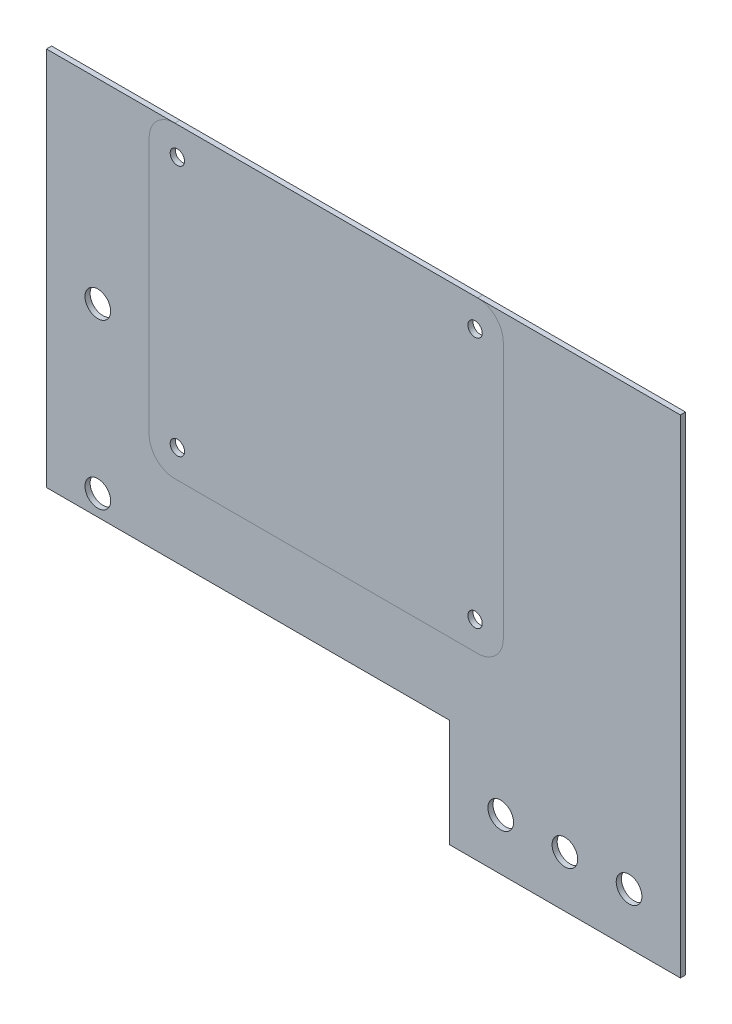
ISO-10303-21;
HEADER;
FILE_DESCRIPTION(('STEP AP214'),'2;1');
FILE_NAME('part.step','',(''),(''),'','','');
FILE_SCHEMA(('AUTOMOTIVE_DESIGN { 1 0 10303 214 1 1 1 1 }'));
ENDSEC;
DATA;
#1=APPLICATION_CONTEXT('core data for automotive mechanical design processes');
#2=APPLICATION_PROTOCOL_DEFINITION('international standard','automotive_design',2000,#1);
#3=PRODUCT_CONTEXT('',#1,'mechanical');
#4=PRODUCT('Part','Part','',(#3));
#5=PRODUCT_RELATED_PRODUCT_CATEGORY('part','',(#4));
#6=PRODUCT_DEFINITION_FORMATION('','',#4);
#7=PRODUCT_DEFINITION_CONTEXT('part definition',#1,'design');
#8=PRODUCT_DEFINITION('design','',#6,#7);
#9=PRODUCT_DEFINITION_SHAPE('','',#8);
#10=(LENGTH_UNIT() NAMED_UNIT(*) SI_UNIT(.MILLI.,.METRE.));
#11=(NAMED_UNIT(*) PLANE_ANGLE_UNIT() SI_UNIT($,.RADIAN.));
#12=(NAMED_UNIT(*) SI_UNIT($,.STERADIAN.) SOLID_ANGLE_UNIT());
#13=UNCERTAINTY_MEASURE_WITH_UNIT(LENGTH_MEASURE(1.E-05),#10,'distance_accuracy_value','');
#14=(GEOMETRIC_REPRESENTATION_CONTEXT(3) GLOBAL_UNCERTAINTY_ASSIGNED_CONTEXT((#13)) GLOBAL_UNIT_ASSIGNED_CONTEXT((#10,
#11,#12)) REPRESENTATION_CONTEXT('',''));
#15=CARTESIAN_POINT('',(0.,0.,0.));
#16=DIRECTION('',(0.,0.,1.));
#17=DIRECTION('',(1.,0.,0.));
#18=AXIS2_PLACEMENT_3D('',#15,#16,#17);
#19=CARTESIAN_POINT('',(80.2271756833517,0.,53.9908655605488));
#20=DIRECTION('',(-1.,0.,0.));
#21=DIRECTION('',(0.,-1.,0.));
#22=AXIS2_PLACEMENT_3D('',#19,#20,#21);
#23=PLANE('',#22);
#24=DIRECTION('',(0.,-1.,0.));
#25=VECTOR('',#24,1.);
#26=CARTESIAN_POINT('',(80.2271756833517,0.,54.9908655605488));
#27=LINE('',#26,#25);
#28=CARTESIAN_POINT('',(80.2271756833517,64.3578080314677,54.9908655605488));
#29=VERTEX_POINT('',#28);
#30=CARTESIAN_POINT('',(80.2271756833517,-30.6421919685324,54.9908655605488));
#31=VERTEX_POINT('',#30);
#32=EDGE_CURVE('E194',#29,#31,#27,.T.);
#33=ORIENTED_EDGE('',*,*,#32,.T.);
#34=DIRECTION('',(0.,0.,1.));
#35=VECTOR('',#34,1.);
#36=CARTESIAN_POINT('',(80.2271756833517,-30.6421919685324,53.9908655605488));
#37=LINE('',#36,#35);
#38=CARTESIAN_POINT('',(80.2271756833517,-30.6421919685324,53.9908655605488));
#39=VERTEX_POINT('',#38);
#40=EDGE_CURVE('E12',#39,#31,#37,.T.);
#41=ORIENTED_EDGE('',*,*,#40,.F.);
#42=DIRECTION('',(0.,-1.,0.));
#43=VECTOR('',#42,1.);
#44=CARTESIAN_POINT('',(80.2271756833517,0.,53.9908655605488));
#45=LINE('',#44,#43);
#46=CARTESIAN_POINT('',(80.2271756833517,64.3578080314677,53.9908655605488));
#47=VERTEX_POINT('',#46);
#48=EDGE_CURVE('E64',#47,#39,#45,.T.);
#49=ORIENTED_EDGE('',*,*,#48,.F.);
#50=DIRECTION('',(0.,0.,1.));
#51=VECTOR('',#50,1.);
#52=CARTESIAN_POINT('',(80.2271756833517,64.3578080314677,53.9908655605488));
#53=LINE('',#52,#51);
#54=EDGE_CURVE('E49',#47,#29,#53,.T.);
#55=ORIENTED_EDGE('',*,*,#54,.T.);
#56=EDGE_LOOP('',(#33,#41,#49,#55));
#57=FACE_BOUND('',#56,.T.);
#58=ADVANCED_FACE('F46',(#57),#23,.F.);
#59=CARTESIAN_POINT('',(0.,-30.6421919685324,53.9908655605488));
#60=DIRECTION('',(0.,-1.,0.));
#61=DIRECTION('',(1.,0.,0.));
#62=AXIS2_PLACEMENT_3D('',#59,#60,#61);
#63=PLANE('',#62);
#64=DIRECTION('',(1.,0.,0.));
#65=VECTOR('',#64,1.);
#66=CARTESIAN_POINT('',(0.,-30.6421919685324,54.9908655605488));
#67=LINE('',#66,#65);
#68=CARTESIAN_POINT('',(35.2271756833517,-30.6421919685324,54.9908655605488));
#69=VERTEX_POINT('',#68);
#70=EDGE_CURVE('E219',#69,#31,#67,.T.);
#71=ORIENTED_EDGE('',*,*,#70,.F.);
#72=DIRECTION('',(0.,0.,1.));
#73=VECTOR('',#72,1.);
#74=CARTESIAN_POINT('',(35.2271756833517,-30.6421919685324,53.9908655605488));
#75=LINE('',#74,#73);
#76=CARTESIAN_POINT('',(35.2271756833517,-30.6421919685324,53.9908655605488));
#77=VERTEX_POINT('',#76);
#78=EDGE_CURVE('E55',#77,#69,#75,.T.);
#79=ORIENTED_EDGE('',*,*,#78,.F.);
#80=DIRECTION('',(1.,0.,0.));
#81=VECTOR('',#80,1.);
#82=CARTESIAN_POINT('',(0.,-30.6421919685324,53.9908655605488));
#83=LINE('',#82,#81);
#84=EDGE_CURVE('E161',#77,#39,#83,.T.);
#85=ORIENTED_EDGE('',*,*,#84,.T.);
#86=ORIENTED_EDGE('',*,*,#40,.T.);
#87=EDGE_LOOP('',(#71,#79,#85,#86));
#88=FACE_BOUND('',#87,.T.);
#89=ADVANCED_FACE('F273',(#88),#63,.T.);
#90=CARTESIAN_POINT('',(35.2271756833517,0.,53.9908655605488));
#91=DIRECTION('',(1.,0.,0.));
#92=DIRECTION('',(0.,0.,-1.));
#93=AXIS2_PLACEMENT_3D('',#90,#91,#92);
#94=PLANE('',#93);
#95=DIRECTION('',(0.,1.,0.));
#96=VECTOR('',#95,1.);
#97=CARTESIAN_POINT('',(35.2271756833517,0.,54.9908655605488));
#98=LINE('',#97,#96);
#99=CARTESIAN_POINT('',(35.2271756833517,-9.64219196853236,54.9908655605488));
#100=VERTEX_POINT('',#99);
#101=EDGE_CURVE('E165',#69,#100,#98,.T.);
#102=ORIENTED_EDGE('',*,*,#101,.T.);
#103=DIRECTION('',(0.,0.,1.));
#104=VECTOR('',#103,1.);
#105=CARTESIAN_POINT('',(35.2271756833517,-9.64219196853236,53.9908655605488));
#106=LINE('',#105,#104);
#107=CARTESIAN_POINT('',(35.2271756833517,-9.64219196853236,53.9908655605488));
#108=VERTEX_POINT('',#107);
#109=EDGE_CURVE('E163',#108,#100,#106,.T.);
#110=ORIENTED_EDGE('',*,*,#109,.F.);
#111=DIRECTION('',(0.,1.,0.));
#112=VECTOR('',#111,1.);
#113=CARTESIAN_POINT('',(35.2271756833517,0.,53.9908655605488));
#114=LINE('',#113,#112);
#115=EDGE_CURVE('E153',#77,#108,#114,.T.);
#116=ORIENTED_EDGE('',*,*,#115,.F.);
#117=ORIENTED_EDGE('',*,*,#78,.T.);
#118=EDGE_LOOP('',(#102,#110,#116,#117));
#119=FACE_BOUND('',#118,.T.);
#120=ADVANCED_FACE('F164',(#119),#94,.F.);
#121=CARTESIAN_POINT('',(0.,-9.64219196853236,53.9908655605488));
#122=DIRECTION('',(0.,-1.,0.));
#123=DIRECTION('',(0.,0.,-1.));
#124=AXIS2_PLACEMENT_3D('',#121,#122,#123);
#125=PLANE('',#124);
#126=DIRECTION('',(1.,0.,0.));
#127=VECTOR('',#126,1.);
#128=CARTESIAN_POINT('',(0.,-9.64219196853236,54.9908655605488));
#129=LINE('',#128,#127);
#130=CARTESIAN_POINT('',(-43.2728243166483,-9.64219196853236,54.9908655605488));
#131=VERTEX_POINT('',#130);
#132=EDGE_CURVE('E216',#131,#100,#129,.T.);
#133=ORIENTED_EDGE('',*,*,#132,.F.);
#134=DIRECTION('',(0.,0.,1.));
#135=VECTOR('',#134,1.);
#136=CARTESIAN_POINT('',(-43.2728243166483,-9.64219196853236,53.9908655605488));
#137=LINE('',#136,#135);
#138=CARTESIAN_POINT('',(-43.2728243166483,-9.64219196853236,53.9908655605488));
#139=VERTEX_POINT('',#138);
#140=EDGE_CURVE('E169',#139,#131,#137,.T.);
#141=ORIENTED_EDGE('',*,*,#140,.F.);
#142=DIRECTION('',(1.,0.,0.));
#143=VECTOR('',#142,1.);
#144=CARTESIAN_POINT('',(0.,-9.64219196853236,53.9908655605488));
#145=LINE('',#144,#143);
#146=EDGE_CURVE('E159',#139,#108,#145,.T.);
#147=ORIENTED_EDGE('',*,*,#146,.T.);
#148=ORIENTED_EDGE('',*,*,#109,.T.);
#149=EDGE_LOOP('',(#133,#141,#147,#148));
#150=FACE_BOUND('',#149,.T.);
#151=ADVANCED_FACE('F171',(#150),#125,.T.);
#152=CARTESIAN_POINT('',(-43.2728243166483,0.,53.9908655605488));
#153=DIRECTION('',(-1.,0.,0.));
#154=DIRECTION('',(0.,-1.,0.));
#155=AXIS2_PLACEMENT_3D('',#152,#153,#154);
#156=PLANE('',#155);
#157=DIRECTION('',(0.,-1.,0.));
#158=VECTOR('',#157,1.);
#159=CARTESIAN_POINT('',(-43.2728243166483,0.,54.9908655605488));
#160=LINE('',#159,#158);
#161=CARTESIAN_POINT('',(-43.2728243166483,64.3578080314677,54.9908655605488));
#162=VERTEX_POINT('',#161);
#163=EDGE_CURVE('E213',#162,#131,#160,.T.);
#164=ORIENTED_EDGE('',*,*,#163,.F.);
#165=DIRECTION('',(0.,0.,1.));
#166=VECTOR('',#165,1.);
#167=CARTESIAN_POINT('',(-43.2728243166483,64.3578080314677,53.9908655605488));
#168=LINE('',#167,#166);
#169=CARTESIAN_POINT('',(-43.2728243166483,64.3578080314677,53.9908655605488));
#170=VERTEX_POINT('',#169);
#171=EDGE_CURVE('E239',#170,#162,#168,.T.);
#172=ORIENTED_EDGE('',*,*,#171,.F.);
#173=DIRECTION('',(0.,-1.,0.));
#174=VECTOR('',#173,1.);
#175=CARTESIAN_POINT('',(-43.2728243166483,0.,53.9908655605488));
#176=LINE('',#175,#174);
#177=EDGE_CURVE('E172',#170,#139,#176,.T.);
#178=ORIENTED_EDGE('',*,*,#177,.T.);
#179=ORIENTED_EDGE('',*,*,#140,.T.);
#180=EDGE_LOOP('',(#164,#172,#178,#179));
#181=FACE_BOUND('',#180,.T.);
#182=ADVANCED_FACE('F287',(#181),#156,.T.);
#183=CARTESIAN_POINT('',(0.,64.3578080314677,53.9908655605488));
#184=DIRECTION('',(0.,-1.,0.));
#185=DIRECTION('',(0.,0.,-1.));
#186=AXIS2_PLACEMENT_3D('',#183,#184,#185);
#187=PLANE('',#186);
#188=DIRECTION('',(1.,0.,0.));
#189=VECTOR('',#188,1.);
#190=CARTESIAN_POINT('',(0.,64.3578080314677,54.9908655605488));
#191=LINE('',#190,#189);
#192=CARTESIAN_POINT('',(-18.2728243166483,64.3578080314677,54.9908655605488));
#193=VERTEX_POINT('',#192);
#194=EDGE_CURVE('E199',#162,#193,#191,.T.);
#195=ORIENTED_EDGE('',*,*,#194,.T.);
#196=DIRECTION('',(0.,0.,1.));
#197=VECTOR('',#196,1.);
#198=CARTESIAN_POINT('',(-18.2728243166483,64.3578080314677,53.9908655605488));
#199=LINE('',#198,#197);
#200=CARTESIAN_POINT('',(-18.2728243166483,64.3578080314677,53.9908655605488));
#201=VERTEX_POINT('',#200);
#202=EDGE_CURVE('E241',#201,#193,#199,.T.);
#203=ORIENTED_EDGE('',*,*,#202,.F.);
#204=DIRECTION('',(1.,0.,0.));
#205=VECTOR('',#204,1.);
#206=CARTESIAN_POINT('',(0.,64.3578080314677,53.9908655605488));
#207=LINE('',#206,#205);
#208=EDGE_CURVE('E174',#170,#201,#207,.T.);
#209=ORIENTED_EDGE('',*,*,#208,.F.);
#210=ORIENTED_EDGE('',*,*,#171,.T.);
#211=EDGE_LOOP('',(#195,#203,#209,#210));
#212=FACE_BOUND('',#211,.T.);
#213=ADVANCED_FACE('F290',(#212),#187,.F.);
#214=CARTESIAN_POINT('',(-18.2728243166483,59.3578080314678,53.9908655605488));
#215=DIRECTION('',(0.,0.,1.));
#216=DIRECTION('',(1.,0.,0.));
#217=AXIS2_PLACEMENT_3D('',#214,#215,#216);
#218=CYLINDRICAL_SURFACE('',#217,4.99999999999999);
#219=CARTESIAN_POINT('',(-18.2728243166483,59.3578080314678,54.9908655605488));
#220=DIRECTION('',(0.,0.,1.));
#221=DIRECTION('',(1.,0.,0.));
#222=AXIS2_PLACEMENT_3D('',#219,#220,#221);
#223=CIRCLE('',#222,4.99999999999999);
#224=CARTESIAN_POINT('',(-23.2728243166483,59.3578080314677,54.9908655605488));
#225=VERTEX_POINT('',#224);
#226=EDGE_CURVE('E211',#193,#225,#223,.T.);
#227=ORIENTED_EDGE('',*,*,#226,.T.);
#228=DIRECTION('',(0.,0.,1.));
#229=VECTOR('',#228,1.);
#230=CARTESIAN_POINT('',(-23.2728243166483,59.3578080314677,53.9908655605488));
#231=LINE('',#230,#229);
#232=CARTESIAN_POINT('',(-23.2728243166483,59.3578080314677,53.9908655605488));
#233=VERTEX_POINT('',#232);
#234=EDGE_CURVE('E244',#233,#225,#231,.T.);
#235=ORIENTED_EDGE('',*,*,#234,.F.);
#236=CARTESIAN_POINT('',(-18.2728243166483,59.3578080314678,53.9908655605488));
#237=DIRECTION('',(0.,0.,1.));
#238=DIRECTION('',(1.,0.,0.));
#239=AXIS2_PLACEMENT_3D('',#236,#237,#238);
#240=CIRCLE('',#239,4.99999999999999);
#241=EDGE_CURVE('E353',#201,#233,#240,.T.);
#242=ORIENTED_EDGE('',*,*,#241,.F.);
#243=ORIENTED_EDGE('',*,*,#202,.T.);
#244=EDGE_LOOP('',(#227,#235,#242,#243));
#245=FACE_BOUND('',#244,.T.);
#246=ADVANCED_FACE('F294',(#245),#218,.F.);
#247=CARTESIAN_POINT('',(-23.2728243166483,0.,53.9908655605488));
#248=DIRECTION('',(-1.,0.,0.));
#249=DIRECTION('',(0.,-1.,0.));
#250=AXIS2_PLACEMENT_3D('',#247,#248,#249);
#251=PLANE('',#250);
#252=DIRECTION('',(0.,-1.,0.));
#253=VECTOR('',#252,1.);
#254=CARTESIAN_POINT('',(-23.2728243166483,0.,54.9908655605488));
#255=LINE('',#254,#253);
#256=CARTESIAN_POINT('',(-23.2728243166483,9.35780803146777,54.9908655605488));
#257=VERTEX_POINT('',#256);
#258=EDGE_CURVE('E209',#225,#257,#255,.T.);
#259=ORIENTED_EDGE('',*,*,#258,.T.);
#260=DIRECTION('',(0.,0.,1.));
#261=VECTOR('',#260,1.);
#262=CARTESIAN_POINT('',(-23.2728243166483,9.35780803146777,53.9908655605488));
#263=LINE('',#262,#261);
#264=CARTESIAN_POINT('',(-23.2728243166483,9.35780803146777,53.9908655605488));
#265=VERTEX_POINT('',#264);
#266=EDGE_CURVE('E247',#265,#257,#263,.T.);
#267=ORIENTED_EDGE('',*,*,#266,.F.);
#268=DIRECTION('',(0.,-1.,0.));
#269=VECTOR('',#268,1.);
#270=CARTESIAN_POINT('',(-23.2728243166483,0.,53.9908655605488));
#271=LINE('',#270,#269);
#272=EDGE_CURVE('E350',#233,#265,#271,.T.);
#273=ORIENTED_EDGE('',*,*,#272,.F.);
#274=ORIENTED_EDGE('',*,*,#234,.T.);
#275=EDGE_LOOP('',(#259,#267,#273,#274));
#276=FACE_BOUND('',#275,.T.);
#277=ADVANCED_FACE('F299',(#276),#251,.F.);
#278=CARTESIAN_POINT('',(-18.2728243166483,9.35780803146775,53.9908655605488));
#279=DIRECTION('',(0.,0.,1.));
#280=DIRECTION('',(1.,0.,0.));
#281=AXIS2_PLACEMENT_3D('',#278,#279,#280);
#282=CYLINDRICAL_SURFACE('',#281,5.);
#283=CARTESIAN_POINT('',(-18.2728243166483,9.35780803146775,54.9908655605488));
#284=DIRECTION('',(0.,0.,1.));
#285=DIRECTION('',(1.,0.,0.));
#286=AXIS2_PLACEMENT_3D('',#283,#284,#285);
#287=CIRCLE('',#286,5.);
#288=CARTESIAN_POINT('',(-18.2728243166483,4.35780803146775,54.9908655605488));
#289=VERTEX_POINT('',#288);
#290=EDGE_CURVE('E207',#257,#289,#287,.T.);
#291=ORIENTED_EDGE('',*,*,#290,.T.);
#292=DIRECTION('',(0.,0.,1.));
#293=VECTOR('',#292,1.);
#294=CARTESIAN_POINT('',(-18.2728243166483,4.35780803146775,53.9908655605488));
#295=LINE('',#294,#293);
#296=CARTESIAN_POINT('',(-18.2728243166483,4.35780803146775,53.9908655605488));
#297=VERTEX_POINT('',#296);
#298=EDGE_CURVE('E250',#297,#289,#295,.T.);
#299=ORIENTED_EDGE('',*,*,#298,.F.);
#300=CARTESIAN_POINT('',(-18.2728243166483,9.35780803146775,53.9908655605488));
#301=DIRECTION('',(0.,0.,1.));
#302=DIRECTION('',(1.,0.,0.));
#303=AXIS2_PLACEMENT_3D('',#300,#301,#302);
#304=CIRCLE('',#303,5.);
#305=EDGE_CURVE('E348',#265,#297,#304,.T.);
#306=ORIENTED_EDGE('',*,*,#305,.F.);
#307=ORIENTED_EDGE('',*,*,#266,.T.);
#308=EDGE_LOOP('',(#291,#299,#306,#307));
#309=FACE_BOUND('',#308,.T.);
#310=ADVANCED_FACE('F303',(#309),#282,.F.);
#311=CARTESIAN_POINT('',(0.,4.35780803146775,53.9908655605488));
#312=DIRECTION('',(0.,-1.,0.));
#313=DIRECTION('',(0.,0.,-1.));
#314=AXIS2_PLACEMENT_3D('',#311,#312,#313);
#315=PLANE('',#314);
#316=DIRECTION('',(1.,0.,0.));
#317=VECTOR('',#316,1.);
#318=CARTESIAN_POINT('',(0.,4.35780803146775,54.9908655605488));
#319=LINE('',#318,#317);
#320=CARTESIAN_POINT('',(40.7271756833517,4.35780803146771,54.9908655605488));
#321=VERTEX_POINT('',#320);
#322=EDGE_CURVE('E205',#289,#321,#319,.T.);
#323=ORIENTED_EDGE('',*,*,#322,.T.);
#324=DIRECTION('',(0.,0.,1.));
#325=VECTOR('',#324,1.);
#326=CARTESIAN_POINT('',(40.7271756833517,4.35780803146771,53.9908655605488));
#327=LINE('',#326,#325);
#328=CARTESIAN_POINT('',(40.7271756833517,4.35780803146771,53.9908655605488));
#329=VERTEX_POINT('',#328);
#330=EDGE_CURVE('E253',#329,#321,#327,.T.);
#331=ORIENTED_EDGE('',*,*,#330,.F.);
#332=DIRECTION('',(1.,0.,0.));
#333=VECTOR('',#332,1.);
#334=CARTESIAN_POINT('',(0.,4.35780803146775,53.9908655605488));
#335=LINE('',#334,#333);
#336=EDGE_CURVE('E341',#297,#329,#335,.T.);
#337=ORIENTED_EDGE('',*,*,#336,.F.);
#338=ORIENTED_EDGE('',*,*,#298,.T.);
#339=EDGE_LOOP('',(#323,#331,#337,#338));
#340=FACE_BOUND('',#339,.T.);
#341=ADVANCED_FACE('F307',(#340),#315,.F.);
#342=CARTESIAN_POINT('',(40.7271756833517,9.35780803146761,53.9908655605488));
#343=DIRECTION('',(0.,0.,1.));
#344=DIRECTION('',(1.,0.,0.));
#345=AXIS2_PLACEMENT_3D('',#342,#343,#344);
#346=CYLINDRICAL_SURFACE('',#345,4.9999999999999);
#347=CARTESIAN_POINT('',(40.7271756833517,9.35780803146761,54.9908655605488));
#348=DIRECTION('',(0.,0.,1.));
#349=DIRECTION('',(1.,0.,0.));
#350=AXIS2_PLACEMENT_3D('',#347,#348,#349);
#351=CIRCLE('',#350,4.9999999999999);
#352=CARTESIAN_POINT('',(45.7271756833517,9.35780803146761,54.9908655605488));
#353=VERTEX_POINT('',#352);
#354=EDGE_CURVE('E203',#321,#353,#351,.T.);
#355=ORIENTED_EDGE('',*,*,#354,.T.);
#356=DIRECTION('',(0.,0.,1.));
#357=VECTOR('',#356,1.);
#358=CARTESIAN_POINT('',(45.7271756833517,9.35780803146761,53.9908655605488));
#359=LINE('',#358,#357);
#360=CARTESIAN_POINT('',(45.7271756833517,9.35780803146761,53.9908655605488));
#361=VERTEX_POINT('',#360);
#362=EDGE_CURVE('E256',#361,#353,#359,.T.);
#363=ORIENTED_EDGE('',*,*,#362,.F.);
#364=CARTESIAN_POINT('',(40.7271756833517,9.35780803146761,53.9908655605488));
#365=DIRECTION('',(0.,0.,1.));
#366=DIRECTION('',(1.,0.,0.));
#367=AXIS2_PLACEMENT_3D('',#364,#365,#366);
#368=CIRCLE('',#367,4.9999999999999);
#369=EDGE_CURVE('E338',#329,#361,#368,.T.);
#370=ORIENTED_EDGE('',*,*,#369,.F.);
#371=ORIENTED_EDGE('',*,*,#330,.T.);
#372=EDGE_LOOP('',(#355,#363,#370,#371));
#373=FACE_BOUND('',#372,.T.);
#374=ADVANCED_FACE('F311',(#373),#346,.F.);
#375=CARTESIAN_POINT('',(45.7271756833516,0.,53.9908655605488));
#376=DIRECTION('',(1.,0.,0.));
#377=DIRECTION('',(0.,1.,0.));
#378=AXIS2_PLACEMENT_3D('',#375,#376,#377);
#379=PLANE('',#378);
#380=DIRECTION('',(0.,1.,0.));
#381=VECTOR('',#380,1.);
#382=CARTESIAN_POINT('',(45.7271756833516,0.,54.9908655605488));
#383=LINE('',#382,#381);
#384=CARTESIAN_POINT('',(45.7271756833518,59.3578080314676,54.9908655605488));
#385=VERTEX_POINT('',#384);
#386=EDGE_CURVE('E201',#353,#385,#383,.T.);
#387=ORIENTED_EDGE('',*,*,#386,.T.);
#388=DIRECTION('',(0.,0.,1.));
#389=VECTOR('',#388,1.);
#390=CARTESIAN_POINT('',(45.7271756833518,59.3578080314676,53.9908655605488));
#391=LINE('',#390,#389);
#392=CARTESIAN_POINT('',(45.7271756833518,59.3578080314676,53.9908655605488));
#393=VERTEX_POINT('',#392);
#394=EDGE_CURVE('E259',#393,#385,#391,.T.);
#395=ORIENTED_EDGE('',*,*,#394,.F.);
#396=DIRECTION('',(0.,1.,0.));
#397=VECTOR('',#396,1.);
#398=CARTESIAN_POINT('',(45.7271756833516,0.,53.9908655605488));
#399=LINE('',#398,#397);
#400=EDGE_CURVE('E336',#361,#393,#399,.T.);
#401=ORIENTED_EDGE('',*,*,#400,.F.);
#402=ORIENTED_EDGE('',*,*,#362,.T.);
#403=EDGE_LOOP('',(#387,#395,#401,#402));
#404=FACE_BOUND('',#403,.T.);
#405=ADVANCED_FACE('F315',(#404),#379,.F.);
#406=CARTESIAN_POINT('',(40.7271756833517,59.3578080314676,53.9908655605488));
#407=DIRECTION('',(0.,0.,1.));
#408=DIRECTION('',(1.,0.,0.));
#409=AXIS2_PLACEMENT_3D('',#406,#407,#408);
#410=CYLINDRICAL_SURFACE('',#409,5.00000000000004);
#411=CARTESIAN_POINT('',(40.7271756833517,59.3578080314676,54.9908655605488));
#412=DIRECTION('',(0.,0.,1.));
#413=DIRECTION('',(1.,0.,0.));
#414=AXIS2_PLACEMENT_3D('',#411,#412,#413);
#415=CIRCLE('',#414,5.00000000000004);
#416=CARTESIAN_POINT('',(40.7271756833517,64.3578080314677,54.9908655605488));
#417=VERTEX_POINT('',#416);
#418=EDGE_CURVE('E198',#385,#417,#415,.T.);
#419=ORIENTED_EDGE('',*,*,#418,.T.);
#420=DIRECTION('',(0.,0.,1.));
#421=VECTOR('',#420,1.);
#422=CARTESIAN_POINT('',(40.7271756833517,64.3578080314677,53.9908655605488));
#423=LINE('',#422,#421);
#424=CARTESIAN_POINT('',(40.7271756833517,64.3578080314677,53.9908655605488));
#425=VERTEX_POINT('',#424);
#426=EDGE_CURVE('E261',#425,#417,#423,.T.);
#427=ORIENTED_EDGE('',*,*,#426,.F.);
#428=CARTESIAN_POINT('',(40.7271756833517,59.3578080314676,53.9908655605488));
#429=DIRECTION('',(0.,0.,1.));
#430=DIRECTION('',(1.,0.,0.));
#431=AXIS2_PLACEMENT_3D('',#428,#429,#430);
#432=CIRCLE('',#431,5.00000000000004);
#433=EDGE_CURVE('E361',#393,#425,#432,.T.);
#434=ORIENTED_EDGE('',*,*,#433,.F.);
#435=ORIENTED_EDGE('',*,*,#394,.T.);
#436=EDGE_LOOP('',(#419,#427,#434,#435));
#437=FACE_BOUND('',#436,.T.);
#438=ADVANCED_FACE('F318',(#437),#410,.F.);
#439=CARTESIAN_POINT('',(57.7271756833517,-20.6421919685324,53.9908655605488));
#440=DIRECTION('',(0.,0.,1.));
#441=DIRECTION('',(1.,0.,0.));
#442=AXIS2_PLACEMENT_3D('',#439,#440,#441);
#443=CYLINDRICAL_SURFACE('',#442,2.5);
#444=CARTESIAN_POINT('',(57.7271756833517,-20.6421919685324,53.9908655605488));
#445=DIRECTION('',(0.,0.,1.));
#446=DIRECTION('',(1.,0.,0.));
#447=AXIS2_PLACEMENT_3D('',#444,#445,#446);
#448=CIRCLE('',#447,2.5);
#449=CARTESIAN_POINT('',(60.2271756833517,-20.6421919685324,53.9908655605488));
#450=VERTEX_POINT('',#449);
#451=EDGE_CURVE('E188',#450,#450,#448,.T.);
#452=ORIENTED_EDGE('',*,*,#451,.F.);
#453=EDGE_LOOP('',(#452));
#454=FACE_BOUND('',#453,.T.);
#455=CARTESIAN_POINT('',(57.7271756833517,-20.6421919685324,54.9908655605488));
#456=DIRECTION('',(0.,0.,1.));
#457=DIRECTION('',(1.,0.,0.));
#458=AXIS2_PLACEMENT_3D('',#455,#456,#457);
#459=CIRCLE('',#458,2.5);
#460=CARTESIAN_POINT('',(60.2271756833517,-20.6421919685324,54.9908655605488));
#461=VERTEX_POINT('',#460);
#462=EDGE_CURVE('E231',#461,#461,#459,.T.);
#463=ORIENTED_EDGE('',*,*,#462,.T.);
#464=EDGE_LOOP('',(#463));
#465=FACE_BOUND('',#464,.T.);
#466=ADVANCED_FACE('F321',(#454,#465),#443,.F.);
#467=CARTESIAN_POINT('',(70.2271756833517,-20.6421919685324,53.9908655605488));
#468=DIRECTION('',(0.,0.,1.));
#469=DIRECTION('',(1.,0.,0.));
#470=AXIS2_PLACEMENT_3D('',#467,#468,#469);
#471=CYLINDRICAL_SURFACE('',#470,2.5);
#472=CARTESIAN_POINT('',(70.2271756833517,-20.6421919685324,53.9908655605488));
#473=DIRECTION('',(0.,0.,1.));
#474=DIRECTION('',(1.,0.,0.));
#475=AXIS2_PLACEMENT_3D('',#472,#473,#474);
#476=CIRCLE('',#475,2.5);
#477=CARTESIAN_POINT('',(72.7271756833517,-20.6421919685324,53.9908655605488));
#478=VERTEX_POINT('',#477);
#479=EDGE_CURVE('E185',#478,#478,#476,.T.);
#480=ORIENTED_EDGE('',*,*,#479,.F.);
#481=EDGE_LOOP('',(#480));
#482=FACE_BOUND('',#481,.T.);
#483=CARTESIAN_POINT('',(70.2271756833517,-20.6421919685324,54.9908655605488));
#484=DIRECTION('',(0.,0.,1.));
#485=DIRECTION('',(1.,0.,0.));
#486=AXIS2_PLACEMENT_3D('',#483,#484,#485);
#487=CIRCLE('',#486,2.5);
#488=CARTESIAN_POINT('',(72.7271756833517,-20.6421919685324,54.9908655605488));
#489=VERTEX_POINT('',#488);
#490=EDGE_CURVE('E228',#489,#489,#487,.T.);
#491=ORIENTED_EDGE('',*,*,#490,.T.);
#492=EDGE_LOOP('',(#491));
#493=FACE_BOUND('',#492,.T.);
#494=ADVANCED_FACE('F326',(#482,#493),#471,.F.);
#495=CARTESIAN_POINT('',(-33.2728243166483,-5.64219196853236,53.9908655605488));
#496=DIRECTION('',(0.,0.,1.));
#497=DIRECTION('',(1.,0.,0.));
#498=AXIS2_PLACEMENT_3D('',#495,#496,#497);
#499=CYLINDRICAL_SURFACE('',#498,2.5);
#500=CARTESIAN_POINT('',(-33.2728243166483,-5.64219196853236,53.9908655605488));
#501=DIRECTION('',(0.,0.,1.));
#502=DIRECTION('',(1.,0.,0.));
#503=AXIS2_PLACEMENT_3D('',#500,#501,#502);
#504=CIRCLE('',#503,2.5);
#505=CARTESIAN_POINT('',(-30.7728243166483,-5.64219196853236,53.9908655605488));
#506=VERTEX_POINT('',#505);
#507=EDGE_CURVE('E182',#506,#506,#504,.T.);
#508=ORIENTED_EDGE('',*,*,#507,.F.);
#509=EDGE_LOOP('',(#508));
#510=FACE_BOUND('',#509,.T.);
#511=CARTESIAN_POINT('',(-33.2728243166483,-5.64219196853236,54.9908655605488));
#512=DIRECTION('',(0.,0.,1.));
#513=DIRECTION('',(1.,0.,0.));
#514=AXIS2_PLACEMENT_3D('',#511,#512,#513);
#515=CIRCLE('',#514,2.5);
#516=CARTESIAN_POINT('',(-30.7728243166483,-5.64219196853236,54.9908655605488));
#517=VERTEX_POINT('',#516);
#518=EDGE_CURVE('E225',#517,#517,#515,.T.);
#519=ORIENTED_EDGE('',*,*,#518,.T.);
#520=EDGE_LOOP('',(#519));
#521=FACE_BOUND('',#520,.T.);
#522=ADVANCED_FACE('F375',(#510,#521),#499,.F.);
#523=CARTESIAN_POINT('',(-33.2728243166483,26.3578080314676,53.9908655605488));
#524=DIRECTION('',(0.,0.,1.));
#525=DIRECTION('',(1.,0.,0.));
#526=AXIS2_PLACEMENT_3D('',#523,#524,#525);
#527=CYLINDRICAL_SURFACE('',#526,2.5);
#528=CARTESIAN_POINT('',(-33.2728243166483,26.3578080314676,53.9908655605488));
#529=DIRECTION('',(0.,0.,1.));
#530=DIRECTION('',(1.,0.,0.));
#531=AXIS2_PLACEMENT_3D('',#528,#529,#530);
#532=CIRCLE('',#531,2.5);
#533=CARTESIAN_POINT('',(-30.7728243166483,26.3578080314676,53.9908655605488));
#534=VERTEX_POINT('',#533);
#535=EDGE_CURVE('E179',#534,#534,#532,.T.);
#536=ORIENTED_EDGE('',*,*,#535,.F.);
#537=EDGE_LOOP('',(#536));
#538=FACE_BOUND('',#537,.T.);
#539=CARTESIAN_POINT('',(-33.2728243166483,26.3578080314676,54.9908655605488));
#540=DIRECTION('',(0.,0.,1.));
#541=DIRECTION('',(1.,0.,0.));
#542=AXIS2_PLACEMENT_3D('',#539,#540,#541);
#543=CIRCLE('',#542,2.5);
#544=CARTESIAN_POINT('',(-30.7728243166483,26.3578080314676,54.9908655605488));
#545=VERTEX_POINT('',#544);
#546=EDGE_CURVE('E222',#545,#545,#543,.T.);
#547=ORIENTED_EDGE('',*,*,#546,.T.);
#548=EDGE_LOOP('',(#547));
#549=FACE_BOUND('',#548,.T.);
#550=ADVANCED_FACE('F282',(#538,#549),#527,.F.);
#551=EDGE_CURVE('E196',#417,#29,#191,.T.);
#552=ORIENTED_EDGE('',*,*,#551,.T.);
#553=ORIENTED_EDGE('',*,*,#54,.F.);
#554=EDGE_CURVE('E121',#425,#47,#207,.T.);
#555=ORIENTED_EDGE('',*,*,#554,.F.);
#556=ORIENTED_EDGE('',*,*,#426,.T.);
#557=EDGE_LOOP('',(#552,#553,#555,#556));
#558=FACE_BOUND('',#557,.T.);
#559=ADVANCED_FACE('F296',(#558),#187,.F.);
#560=CARTESIAN_POINT('',(45.2271756833517,-20.6421919685324,53.9908655605488));
#561=DIRECTION('',(0.,0.,1.));
#562=DIRECTION('',(1.,0.,0.));
#563=AXIS2_PLACEMENT_3D('',#560,#561,#562);
#564=CYLINDRICAL_SURFACE('',#563,2.5);
#565=CARTESIAN_POINT('',(45.2271756833517,-20.6421919685324,53.9908655605488));
#566=DIRECTION('',(0.,0.,1.));
#567=DIRECTION('',(1.,0.,0.));
#568=AXIS2_PLACEMENT_3D('',#565,#566,#567);
#569=CIRCLE('',#568,2.5);
#570=CARTESIAN_POINT('',(47.7271756833517,-20.6421919685324,53.9908655605488));
#571=VERTEX_POINT('',#570);
#572=EDGE_CURVE('E191',#571,#571,#569,.T.);
#573=ORIENTED_EDGE('',*,*,#572,.F.);
#574=EDGE_LOOP('',(#573));
#575=FACE_BOUND('',#574,.T.);
#576=CARTESIAN_POINT('',(45.2271756833517,-20.6421919685324,54.9908655605488));
#577=DIRECTION('',(0.,0.,1.));
#578=DIRECTION('',(1.,0.,0.));
#579=AXIS2_PLACEMENT_3D('',#576,#577,#578);
#580=CIRCLE('',#579,2.5);
#581=CARTESIAN_POINT('',(47.7271756833517,-20.6421919685324,54.9908655605488));
#582=VERTEX_POINT('',#581);
#583=EDGE_CURVE('E234',#582,#582,#580,.T.);
#584=ORIENTED_EDGE('',*,*,#583,.T.);
#585=EDGE_LOOP('',(#584));
#586=FACE_BOUND('',#585,.T.);
#587=ADVANCED_FACE('F368',(#575,#586),#564,.F.);
#588=CARTESIAN_POINT('',(0.,0.,53.9908655605488));
#589=DIRECTION('',(0.,0.,1.));
#590=DIRECTION('',(1.,0.,0.));
#591=AXIS2_PLACEMENT_3D('',#588,#589,#590);
#592=PLANE('',#591);
#593=ORIENTED_EDGE('',*,*,#48,.T.);
#594=ORIENTED_EDGE('',*,*,#84,.F.);
#595=ORIENTED_EDGE('',*,*,#115,.T.);
#596=ORIENTED_EDGE('',*,*,#146,.F.);
#597=ORIENTED_EDGE('',*,*,#177,.F.);
#598=ORIENTED_EDGE('',*,*,#208,.T.);
#599=ORIENTED_EDGE('',*,*,#241,.T.);
#600=ORIENTED_EDGE('',*,*,#272,.T.);
#601=ORIENTED_EDGE('',*,*,#305,.T.);
#602=ORIENTED_EDGE('',*,*,#336,.T.);
#603=ORIENTED_EDGE('',*,*,#369,.T.);
#604=ORIENTED_EDGE('',*,*,#400,.T.);
#605=ORIENTED_EDGE('',*,*,#433,.T.);
#606=ORIENTED_EDGE('',*,*,#554,.T.);
#607=EDGE_LOOP('',(#593,#594,#595,#596,#597,#598,#599,#600,#601,#602,#603,#604,#605,#606));
#608=FACE_BOUND('',#607,.T.);
#609=ORIENTED_EDGE('',*,*,#535,.T.);
#610=EDGE_LOOP('',(#609));
#611=FACE_BOUND('',#610,.T.);
#612=ORIENTED_EDGE('',*,*,#507,.T.);
#613=EDGE_LOOP('',(#612));
#614=FACE_BOUND('',#613,.T.);
#615=ORIENTED_EDGE('',*,*,#479,.T.);
#616=EDGE_LOOP('',(#615));
#617=FACE_BOUND('',#616,.T.);
#618=ORIENTED_EDGE('',*,*,#451,.T.);
#619=EDGE_LOOP('',(#618));
#620=FACE_BOUND('',#619,.T.);
#621=ORIENTED_EDGE('',*,*,#572,.T.);
#622=EDGE_LOOP('',(#621));
#623=FACE_BOUND('',#622,.T.);
#624=ADVANCED_FACE('F155',(#608,#611,#614,#617,#620,#623),#592,.F.);
#625=CARTESIAN_POINT('',(0.,0.,54.9908655605488));
#626=DIRECTION('',(0.,0.,1.));
#627=DIRECTION('',(1.,0.,0.));
#628=AXIS2_PLACEMENT_3D('',#625,#626,#627);
#629=PLANE('',#628);
#630=ORIENTED_EDGE('',*,*,#32,.F.);
#631=ORIENTED_EDGE('',*,*,#551,.F.);
#632=ORIENTED_EDGE('',*,*,#418,.F.);
#633=ORIENTED_EDGE('',*,*,#386,.F.);
#634=ORIENTED_EDGE('',*,*,#354,.F.);
#635=ORIENTED_EDGE('',*,*,#322,.F.);
#636=ORIENTED_EDGE('',*,*,#290,.F.);
#637=ORIENTED_EDGE('',*,*,#258,.F.);
#638=ORIENTED_EDGE('',*,*,#226,.F.);
#639=ORIENTED_EDGE('',*,*,#194,.F.);
#640=ORIENTED_EDGE('',*,*,#163,.T.);
#641=ORIENTED_EDGE('',*,*,#132,.T.);
#642=ORIENTED_EDGE('',*,*,#101,.F.);
#643=ORIENTED_EDGE('',*,*,#70,.T.);
#644=EDGE_LOOP('',(#630,#631,#632,#633,#634,#635,#636,#637,#638,#639,#640,#641,#642,#643));
#645=FACE_BOUND('',#644,.T.);
#646=ORIENTED_EDGE('',*,*,#546,.F.);
#647=EDGE_LOOP('',(#646));
#648=FACE_BOUND('',#647,.T.);
#649=ORIENTED_EDGE('',*,*,#518,.F.);
#650=EDGE_LOOP('',(#649));
#651=FACE_BOUND('',#650,.T.);
#652=ORIENTED_EDGE('',*,*,#490,.F.);
#653=EDGE_LOOP('',(#652));
#654=FACE_BOUND('',#653,.T.);
#655=ORIENTED_EDGE('',*,*,#462,.F.);
#656=EDGE_LOOP('',(#655));
#657=FACE_BOUND('',#656,.T.);
#658=ORIENTED_EDGE('',*,*,#583,.F.);
#659=EDGE_LOOP('',(#658));
#660=FACE_BOUND('',#659,.T.);
#661=ADVANCED_FACE('F270',(#645,#648,#651,#654,#657,#660),#629,.T.);
#662=CLOSED_SHELL('',(#58,#89,#120,#151,#182,#213,#246,#277,#310,#341,#374,#405,#438,#466,#494,
#522,#550,#559,#587,#624,#661));
#663=MANIFOLD_SOLID_BREP('B2',#662);
#664=CARTESIAN_POINT('',(-18.2728243166483,59.3578080314678,54.2908655605488));
#665=DIRECTION('',(0.,0.,1.));
#666=DIRECTION('',(1.,0.,0.));
#667=AXIS2_PLACEMENT_3D('',#664,#665,#666);
#668=CYLINDRICAL_SURFACE('',#667,4.99999999999999);
#669=DIRECTION('',(0.,0.,1.));
#670=VECTOR('',#669,1.);
#671=CARTESIAN_POINT('',(-23.2728243166483,59.3578080314677,54.2908655605488));
#672=LINE('',#671,#670);
#673=CARTESIAN_POINT('',(-23.2728243166483,59.3578080314677,53.9908655605488));
#674=VERTEX_POINT('',#673);
#675=CARTESIAN_POINT('',(-23.2728243166483,59.3578080314677,54.9908655605488));
#676=VERTEX_POINT('',#675);
#677=EDGE_CURVE('E638',#674,#676,#672,.T.);
#678=ORIENTED_EDGE('',*,*,#677,.T.);
#679=CARTESIAN_POINT('',(-18.2728243166483,59.3578080314678,54.9908655605488));
#680=DIRECTION('',(0.,0.,1.));
#681=DIRECTION('',(1.,0.,0.));
#682=AXIS2_PLACEMENT_3D('',#679,#680,#681);
#683=CIRCLE('',#682,4.99999999999999);
#684=CARTESIAN_POINT('',(-18.2728243166483,64.3578080314677,54.9908655605488));
#685=VERTEX_POINT('',#684);
#686=EDGE_CURVE('E571',#676,#685,#683,.F.);
#687=ORIENTED_EDGE('',*,*,#686,.T.);
#688=DIRECTION('',(0.,0.,1.));
#689=VECTOR('',#688,1.);
#690=CARTESIAN_POINT('',(-18.2728243166483,64.3578080314677,54.2908655605488));
#691=LINE('',#690,#689);
#692=CARTESIAN_POINT('',(-18.2728243166483,64.3578080314677,53.9908655605488));
#693=VERTEX_POINT('',#692);
#694=EDGE_CURVE('E44',#693,#685,#691,.T.);
#695=ORIENTED_EDGE('',*,*,#694,.F.);
#696=CARTESIAN_POINT('',(-18.2728243166483,59.3578080314678,53.9908655605488));
#697=DIRECTION('',(0.,0.,1.));
#698=DIRECTION('',(1.,0.,0.));
#699=AXIS2_PLACEMENT_3D('',#696,#697,#698);
#700=CIRCLE('',#699,4.99999999999999);
#701=EDGE_CURVE('E677',#693,#674,#700,.T.);
#702=ORIENTED_EDGE('',*,*,#701,.T.);
#703=EDGE_LOOP('',(#678,#687,#695,#702));
#704=FACE_BOUND('',#703,.T.);
#705=ADVANCED_FACE('F555',(#704),#668,.T.);
#706=CARTESIAN_POINT('',(40.7271756833517,64.3578080314677,54.2908655605488));
#707=DIRECTION('',(0.,1.,0.));
#708=DIRECTION('',(-1.,0.,0.));
#709=AXIS2_PLACEMENT_3D('',#706,#707,#708);
#710=PLANE('',#709);
#711=ORIENTED_EDGE('',*,*,#694,.T.);
#712=DIRECTION('',(1.,0.,0.));
#713=VECTOR('',#712,1.);
#714=CARTESIAN_POINT('',(40.7271756833517,64.3578080314677,54.9908655605488));
#715=LINE('',#714,#713);
#716=CARTESIAN_POINT('',(40.7271756833517,64.3578080314677,54.9908655605488));
#717=VERTEX_POINT('',#716);
#718=EDGE_CURVE('E709',#685,#717,#715,.T.);
#719=ORIENTED_EDGE('',*,*,#718,.T.);
#720=DIRECTION('',(0.,0.,1.));
#721=VECTOR('',#720,1.);
#722=CARTESIAN_POINT('',(40.7271756833517,64.3578080314677,54.2908655605488));
#723=LINE('',#722,#721);
#724=CARTESIAN_POINT('',(40.7271756833517,64.3578080314676,53.9908655605488));
#725=VERTEX_POINT('',#724);
#726=EDGE_CURVE('E563',#725,#717,#723,.T.);
#727=ORIENTED_EDGE('',*,*,#726,.F.);
#728=DIRECTION('',(-1.,0.,0.));
#729=VECTOR('',#728,1.);
#730=CARTESIAN_POINT('',(40.7271756833517,64.3578080314676,53.9908655605488));
#731=LINE('',#730,#729);
#732=EDGE_CURVE('E674',#725,#693,#731,.T.);
#733=ORIENTED_EDGE('',*,*,#732,.T.);
#734=EDGE_LOOP('',(#711,#719,#727,#733));
#735=FACE_BOUND('',#734,.T.);
#736=ADVANCED_FACE('F717',(#735),#710,.T.);
#737=CARTESIAN_POINT('',(40.7271756833517,59.3578080314676,54.2908655605488));
#738=DIRECTION('',(0.,0.,1.));
#739=DIRECTION('',(1.,0.,0.));
#740=AXIS2_PLACEMENT_3D('',#737,#738,#739);
#741=CYLINDRICAL_SURFACE('',#740,5.00000000000004);
#742=ORIENTED_EDGE('',*,*,#726,.T.);
#743=CARTESIAN_POINT('',(40.7271756833517,59.3578080314676,54.9908655605488));
#744=DIRECTION('',(0.,0.,1.));
#745=DIRECTION('',(1.,0.,0.));
#746=AXIS2_PLACEMENT_3D('',#743,#744,#745);
#747=CIRCLE('',#746,5.00000000000004);
#748=CARTESIAN_POINT('',(45.7271756833517,59.3578080314676,54.9908655605488));
#749=VERTEX_POINT('',#748);
#750=EDGE_CURVE('E707',#717,#749,#747,.F.);
#751=ORIENTED_EDGE('',*,*,#750,.T.);
#752=DIRECTION('',(0.,0.,1.));
#753=VECTOR('',#752,1.);
#754=CARTESIAN_POINT('',(45.7271756833517,59.3578080314676,54.2908655605488));
#755=LINE('',#754,#753);
#756=CARTESIAN_POINT('',(45.7271756833517,59.3578080314676,53.9908655605488));
#757=VERTEX_POINT('',#756);
#758=EDGE_CURVE('E683',#757,#749,#755,.T.);
#759=ORIENTED_EDGE('',*,*,#758,.F.);
#760=CARTESIAN_POINT('',(40.7271756833517,59.3578080314676,53.9908655605488));
#761=DIRECTION('',(0.,0.,1.));
#762=DIRECTION('',(1.,0.,0.));
#763=AXIS2_PLACEMENT_3D('',#760,#761,#762);
#764=CIRCLE('',#763,5.00000000000002);
#765=EDGE_CURVE('E671',#757,#725,#764,.T.);
#766=ORIENTED_EDGE('',*,*,#765,.T.);
#767=EDGE_LOOP('',(#742,#751,#759,#766));
#768=FACE_BOUND('',#767,.T.);
#769=ADVANCED_FACE('F719',(#768),#741,.T.);
#770=CARTESIAN_POINT('',(45.7271756833517,9.35780803146765,54.2908655605488));
#771=DIRECTION('',(1.,0.,0.));
#772=DIRECTION('',(0.,1.,0.));
#773=AXIS2_PLACEMENT_3D('',#770,#771,#772);
#774=PLANE('',#773);
#775=ORIENTED_EDGE('',*,*,#758,.T.);
#776=DIRECTION('',(0.,-1.,0.));
#777=VECTOR('',#776,1.);
#778=CARTESIAN_POINT('',(45.7271756833517,9.35780803146765,54.9908655605488));
#779=LINE('',#778,#777);
#780=CARTESIAN_POINT('',(45.7271756833516,9.35780803146761,54.9908655605488));
#781=VERTEX_POINT('',#780);
#782=EDGE_CURVE('E705',#749,#781,#779,.T.);
#783=ORIENTED_EDGE('',*,*,#782,.T.);
#784=DIRECTION('',(0.,0.,1.));
#785=VECTOR('',#784,1.);
#786=CARTESIAN_POINT('',(45.7271756833516,9.35780803146761,54.2908655605488));
#787=LINE('',#786,#785);
#788=CARTESIAN_POINT('',(45.7271756833516,9.35780803146761,53.9908655605488));
#789=VERTEX_POINT('',#788);
#790=EDGE_CURVE('E686',#789,#781,#787,.T.);
#791=ORIENTED_EDGE('',*,*,#790,.F.);
#792=DIRECTION('',(0.,1.,0.));
#793=VECTOR('',#792,1.);
#794=CARTESIAN_POINT('',(45.7271756833516,9.35780803146761,53.9908655605488));
#795=LINE('',#794,#793);
#796=EDGE_CURVE('E668',#789,#757,#795,.T.);
#797=ORIENTED_EDGE('',*,*,#796,.T.);
#798=EDGE_LOOP('',(#775,#783,#791,#797));
#799=FACE_BOUND('',#798,.T.);
#800=ADVANCED_FACE('F703',(#799),#774,.T.);
#801=CARTESIAN_POINT('',(40.7271756833517,9.35780803146761,54.2908655605488));
#802=DIRECTION('',(0.,0.,1.));
#803=DIRECTION('',(1.,0.,0.));
#804=AXIS2_PLACEMENT_3D('',#801,#802,#803);
#805=CYLINDRICAL_SURFACE('',#804,4.9999999999999);
#806=ORIENTED_EDGE('',*,*,#790,.T.);
#807=CARTESIAN_POINT('',(40.7271756833517,9.35780803146761,54.9908655605488));
#808=DIRECTION('',(0.,0.,1.));
#809=DIRECTION('',(1.,0.,0.));
#810=AXIS2_PLACEMENT_3D('',#807,#808,#809);
#811=CIRCLE('',#810,4.9999999999999);
#812=CARTESIAN_POINT('',(40.7271756833517,4.35780803146775,54.9908655605488));
#813=VERTEX_POINT('',#812);
#814=EDGE_CURVE('E696',#781,#813,#811,.F.);
#815=ORIENTED_EDGE('',*,*,#814,.T.);
#816=DIRECTION('',(0.,0.,1.));
#817=VECTOR('',#816,1.);
#818=CARTESIAN_POINT('',(40.7271756833517,4.35780803146775,54.2908655605488));
#819=LINE('',#818,#817);
#820=CARTESIAN_POINT('',(40.7271756833517,4.35780803146774,53.9908655605488));
#821=VERTEX_POINT('',#820);
#822=EDGE_CURVE('E640',#821,#813,#819,.T.);
#823=ORIENTED_EDGE('',*,*,#822,.F.);
#824=CARTESIAN_POINT('',(40.7271756833517,9.35780803146761,53.9908655605488));
#825=DIRECTION('',(0.,0.,1.));
#826=DIRECTION('',(1.,0.,0.));
#827=AXIS2_PLACEMENT_3D('',#824,#825,#826);
#828=CIRCLE('',#827,4.99999999999987);
#829=EDGE_CURVE('E661',#821,#789,#828,.T.);
#830=ORIENTED_EDGE('',*,*,#829,.T.);
#831=EDGE_LOOP('',(#806,#815,#823,#830));
#832=FACE_BOUND('',#831,.T.);
#833=ADVANCED_FACE('F695',(#832),#805,.T.);
#834=CARTESIAN_POINT('',(-18.2728243166483,4.35780803146775,54.2908655605488));
#835=DIRECTION('',(0.,-1.,0.));
#836=DIRECTION('',(0.,0.,-1.));
#837=AXIS2_PLACEMENT_3D('',#834,#835,#836);
#838=PLANE('',#837);
#839=ORIENTED_EDGE('',*,*,#822,.T.);
#840=DIRECTION('',(-1.,0.,0.));
#841=VECTOR('',#840,1.);
#842=CARTESIAN_POINT('',(-18.2728243166483,4.35780803146775,54.9908655605488));
#843=LINE('',#842,#841);
#844=CARTESIAN_POINT('',(-18.2728243166483,4.35780803146775,54.9908655605488));
#845=VERTEX_POINT('',#844);
#846=EDGE_CURVE('E632',#813,#845,#843,.T.);
#847=ORIENTED_EDGE('',*,*,#846,.T.);
#848=DIRECTION('',(0.,0.,1.));
#849=VECTOR('',#848,1.);
#850=CARTESIAN_POINT('',(-18.2728243166483,4.35780803146775,54.2908655605488));
#851=LINE('',#850,#849);
#852=CARTESIAN_POINT('',(-18.2728243166483,4.35780803146775,53.9908655605488));
#853=VERTEX_POINT('',#852);
#854=EDGE_CURVE('E631',#853,#845,#851,.T.);
#855=ORIENTED_EDGE('',*,*,#854,.F.);
#856=DIRECTION('',(1.,0.,0.));
#857=VECTOR('',#856,1.);
#858=CARTESIAN_POINT('',(-18.2728243166483,4.35780803146775,53.9908655605488));
#859=LINE('',#858,#857);
#860=EDGE_CURVE('E658',#853,#821,#859,.T.);
#861=ORIENTED_EDGE('',*,*,#860,.T.);
#862=EDGE_LOOP('',(#839,#847,#855,#861));
#863=FACE_BOUND('',#862,.T.);
#864=ADVANCED_FACE('F690',(#863),#838,.T.);
#865=CARTESIAN_POINT('',(-18.2728243166483,9.35780803146775,54.2908655605488));
#866=DIRECTION('',(0.,0.,1.));
#867=DIRECTION('',(1.,0.,0.));
#868=AXIS2_PLACEMENT_3D('',#865,#866,#867);
#869=CYLINDRICAL_SURFACE('',#868,5.);
#870=ORIENTED_EDGE('',*,*,#854,.T.);
#871=CARTESIAN_POINT('',(-18.2728243166483,9.35780803146775,54.9908655605488));
#872=DIRECTION('',(0.,0.,1.));
#873=DIRECTION('',(1.,0.,0.));
#874=AXIS2_PLACEMENT_3D('',#871,#872,#873);
#875=CIRCLE('',#874,5.);
#876=CARTESIAN_POINT('',(-23.2728243166483,9.35780803146777,54.9908655605488));
#877=VERTEX_POINT('',#876);
#878=EDGE_CURVE('E623',#845,#877,#875,.F.);
#879=ORIENTED_EDGE('',*,*,#878,.T.);
#880=DIRECTION('',(0.,0.,1.));
#881=VECTOR('',#880,1.);
#882=CARTESIAN_POINT('',(-23.2728243166483,9.35780803146777,54.2908655605488));
#883=LINE('',#882,#881);
#884=CARTESIAN_POINT('',(-23.2728243166483,9.35780803146777,53.9908655605488));
#885=VERTEX_POINT('',#884);
#886=EDGE_CURVE('E579',#885,#877,#883,.T.);
#887=ORIENTED_EDGE('',*,*,#886,.F.);
#888=CARTESIAN_POINT('',(-18.2728243166483,9.35780803146775,53.9908655605488));
#889=DIRECTION('',(0.,0.,1.));
#890=DIRECTION('',(1.,0.,0.));
#891=AXIS2_PLACEMENT_3D('',#888,#889,#890);
#892=CIRCLE('',#891,5.);
#893=EDGE_CURVE('E655',#885,#853,#892,.T.);
#894=ORIENTED_EDGE('',*,*,#893,.T.);
#895=EDGE_LOOP('',(#870,#879,#887,#894));
#896=FACE_BOUND('',#895,.T.);
#897=ADVANCED_FACE('F630',(#896),#869,.T.);
#898=CARTESIAN_POINT('',(-23.2728243166483,59.3578080314677,54.2908655605488));
#899=DIRECTION('',(-1.,0.,0.));
#900=DIRECTION('',(0.,-1.,0.));
#901=AXIS2_PLACEMENT_3D('',#898,#899,#900);
#902=PLANE('',#901);
#903=ORIENTED_EDGE('',*,*,#886,.T.);
#904=DIRECTION('',(0.,1.,0.));
#905=VECTOR('',#904,1.);
#906=CARTESIAN_POINT('',(-23.2728243166483,59.3578080314677,54.9908655605488));
#907=LINE('',#906,#905);
#908=EDGE_CURVE('E620',#877,#676,#907,.T.);
#909=ORIENTED_EDGE('',*,*,#908,.T.);
#910=ORIENTED_EDGE('',*,*,#677,.F.);
#911=DIRECTION('',(0.,-1.,0.));
#912=VECTOR('',#911,1.);
#913=CARTESIAN_POINT('',(-23.2728243166483,59.3578080314677,53.9908655605488));
#914=LINE('',#913,#912);
#915=EDGE_CURVE('E636',#674,#885,#914,.T.);
#916=ORIENTED_EDGE('',*,*,#915,.T.);
#917=EDGE_LOOP('',(#903,#909,#910,#916));
#918=FACE_BOUND('',#917,.T.);
#919=ADVANCED_FACE('F634',(#918),#902,.T.);
#920=CARTESIAN_POINT('',(-17.7728243166483,58.8578080314677,58.4908655605488));
#921=DIRECTION('',(0.,0.,-1.));
#922=DIRECTION('',(-1.,0.,0.));
#923=AXIS2_PLACEMENT_3D('',#920,#921,#922);
#924=CYLINDRICAL_SURFACE('',#923,1.39999999999999);
#925=CARTESIAN_POINT('',(-17.7728243166482,58.8578080314677,53.9908655605488));
#926=DIRECTION('',(0.,0.,1.));
#927=DIRECTION('',(1.,0.,0.));
#928=AXIS2_PLACEMENT_3D('',#925,#926,#927);
#929=CIRCLE('',#928,1.39999999999984);
#930=CARTESIAN_POINT('',(-16.3728243166483,58.8578080314677,53.9908655605488));
#931=VERTEX_POINT('',#930);
#932=EDGE_CURVE('E651',#931,#931,#929,.T.);
#933=ORIENTED_EDGE('',*,*,#932,.F.);
#934=EDGE_LOOP('',(#933));
#935=FACE_BOUND('',#934,.T.);
#936=CARTESIAN_POINT('',(-17.7728243166483,58.8578080314677,54.9908655605488));
#937=DIRECTION('',(0.,0.,1.));
#938=DIRECTION('',(1.,0.,0.));
#939=AXIS2_PLACEMENT_3D('',#936,#937,#938);
#940=CIRCLE('',#939,1.39999999999999);
#941=CARTESIAN_POINT('',(-16.3728243166483,58.8578080314677,54.9908655605488));
#942=VERTEX_POINT('',#941);
#943=EDGE_CURVE('E627',#942,#942,#940,.T.);
#944=ORIENTED_EDGE('',*,*,#943,.T.);
#945=EDGE_LOOP('',(#944));
#946=FACE_BOUND('',#945,.T.);
#947=ADVANCED_FACE('F786',(#935,#946),#924,.F.);
#948=CARTESIAN_POINT('',(40.2271756833518,58.8578080314677,58.4908655605488));
#949=DIRECTION('',(0.,0.,-1.));
#950=DIRECTION('',(-1.,0.,0.));
#951=AXIS2_PLACEMENT_3D('',#948,#949,#950);
#952=CYLINDRICAL_SURFACE('',#951,1.39999999999999);
#953=CARTESIAN_POINT('',(40.2271756833516,58.8578080314677,53.9908655605488));
#954=DIRECTION('',(0.,0.,1.));
#955=DIRECTION('',(1.,0.,0.));
#956=AXIS2_PLACEMENT_3D('',#953,#954,#955);
#957=CIRCLE('',#956,1.39999999999984);
#958=CARTESIAN_POINT('',(41.6271756833515,58.8578080314677,53.9908655605488));
#959=VERTEX_POINT('',#958);
#960=EDGE_CURVE('E653',#959,#959,#957,.T.);
#961=ORIENTED_EDGE('',*,*,#960,.F.);
#962=EDGE_LOOP('',(#961));
#963=FACE_BOUND('',#962,.T.);
#964=CARTESIAN_POINT('',(40.2271756833518,58.8578080314677,54.9908655605488));
#965=DIRECTION('',(0.,0.,1.));
#966=DIRECTION('',(1.,0.,0.));
#967=AXIS2_PLACEMENT_3D('',#964,#965,#966);
#968=CIRCLE('',#967,1.39999999999999);
#969=CARTESIAN_POINT('',(41.6271756833517,58.8578080314677,54.9908655605488));
#970=VERTEX_POINT('',#969);
#971=EDGE_CURVE('E863',#970,#970,#968,.T.);
#972=ORIENTED_EDGE('',*,*,#971,.T.);
#973=EDGE_LOOP('',(#972));
#974=FACE_BOUND('',#973,.T.);
#975=ADVANCED_FACE('F795',(#963,#974),#952,.F.);
#976=CARTESIAN_POINT('',(-17.7728243166484,9.85780803146775,58.4908655605488));
#977=DIRECTION('',(0.,0.,-1.));
#978=DIRECTION('',(-1.,0.,0.));
#979=AXIS2_PLACEMENT_3D('',#976,#977,#978);
#980=CYLINDRICAL_SURFACE('',#979,1.4);
#981=CARTESIAN_POINT('',(-17.7728243166482,9.85780803146746,53.9908655605488));
#982=DIRECTION('',(0.,0.,1.));
#983=DIRECTION('',(1.,0.,0.));
#984=AXIS2_PLACEMENT_3D('',#981,#982,#983);
#985=CIRCLE('',#984,1.39999999999984);
#986=CARTESIAN_POINT('',(-16.3728243166483,9.85780803146746,53.9908655605488));
#987=VERTEX_POINT('',#986);
#988=EDGE_CURVE('E648',#987,#987,#985,.T.);
#989=ORIENTED_EDGE('',*,*,#988,.F.);
#990=EDGE_LOOP('',(#989));
#991=FACE_BOUND('',#990,.T.);
#992=CARTESIAN_POINT('',(-17.7728243166484,9.85780803146775,54.9908655605488));
#993=DIRECTION('',(0.,0.,1.));
#994=DIRECTION('',(1.,0.,0.));
#995=AXIS2_PLACEMENT_3D('',#992,#993,#994);
#996=CIRCLE('',#995,1.4);
#997=CARTESIAN_POINT('',(-16.3728243166484,9.85780803146775,54.9908655605488));
#998=VERTEX_POINT('',#997);
#999=EDGE_CURVE('E861',#998,#998,#996,.T.);
#1000=ORIENTED_EDGE('',*,*,#999,.T.);
#1001=EDGE_LOOP('',(#1000));
#1002=FACE_BOUND('',#1001,.T.);
#1003=ADVANCED_FACE('F807',(#991,#1002),#980,.F.);
#1004=CARTESIAN_POINT('',(40.2271756833516,9.85780803146746,58.4908655605488));
#1005=DIRECTION('',(0.,0.,-1.));
#1006=DIRECTION('',(-1.,0.,0.));
#1007=AXIS2_PLACEMENT_3D('',#1004,#1005,#1006);
#1008=CYLINDRICAL_SURFACE('',#1007,1.39999999999985);
#1009=CARTESIAN_POINT('',(40.2271756833516,9.85780803146746,53.9908655605488));
#1010=DIRECTION('',(0.,0.,1.));
#1011=DIRECTION('',(1.,0.,0.));
#1012=AXIS2_PLACEMENT_3D('',#1009,#1010,#1011);
#1013=CIRCLE('',#1012,1.39999999999984);
#1014=CARTESIAN_POINT('',(41.6271756833515,9.85780803146746,53.9908655605488));
#1015=VERTEX_POINT('',#1014);
#1016=EDGE_CURVE('E645',#1015,#1015,#1013,.T.);
#1017=ORIENTED_EDGE('',*,*,#1016,.F.);
#1018=EDGE_LOOP('',(#1017));
#1019=FACE_BOUND('',#1018,.T.);
#1020=CARTESIAN_POINT('',(40.2271756833516,9.85780803146746,54.9908655605488));
#1021=DIRECTION('',(0.,0.,1.));
#1022=DIRECTION('',(1.,0.,0.));
#1023=AXIS2_PLACEMENT_3D('',#1020,#1021,#1022);
#1024=CIRCLE('',#1023,1.39999999999985);
#1025=CARTESIAN_POINT('',(41.6271756833515,9.85780803146746,54.9908655605488));
#1026=VERTEX_POINT('',#1025);
#1027=EDGE_CURVE('E558',#1026,#1026,#1024,.T.);
#1028=ORIENTED_EDGE('',*,*,#1027,.T.);
#1029=EDGE_LOOP('',(#1028));
#1030=FACE_BOUND('',#1029,.T.);
#1031=ADVANCED_FACE('F818',(#1019,#1030),#1008,.F.);
#1032=CARTESIAN_POINT('',(-18.2728243166483,9.35780803146775,53.9908655605488));
#1033=DIRECTION('',(0.,0.,1.));
#1034=DIRECTION('',(1.,0.,0.));
#1035=AXIS2_PLACEMENT_3D('',#1032,#1033,#1034);
#1036=PLANE('',#1035);
#1037=ORIENTED_EDGE('',*,*,#960,.T.);
#1038=EDGE_LOOP('',(#1037));
#1039=FACE_BOUND('',#1038,.T.);
#1040=ORIENTED_EDGE('',*,*,#932,.T.);
#1041=EDGE_LOOP('',(#1040));
#1042=FACE_BOUND('',#1041,.T.);
#1043=ORIENTED_EDGE('',*,*,#988,.T.);
#1044=EDGE_LOOP('',(#1043));
#1045=FACE_BOUND('',#1044,.T.);
#1046=ORIENTED_EDGE('',*,*,#1016,.T.);
#1047=EDGE_LOOP('',(#1046));
#1048=FACE_BOUND('',#1047,.T.);
#1049=ORIENTED_EDGE('',*,*,#893,.F.);
#1050=ORIENTED_EDGE('',*,*,#915,.F.);
#1051=ORIENTED_EDGE('',*,*,#701,.F.);
#1052=ORIENTED_EDGE('',*,*,#732,.F.);
#1053=ORIENTED_EDGE('',*,*,#765,.F.);
#1054=ORIENTED_EDGE('',*,*,#796,.F.);
#1055=ORIENTED_EDGE('',*,*,#829,.F.);
#1056=ORIENTED_EDGE('',*,*,#860,.F.);
#1057=EDGE_LOOP('',(#1049,#1050,#1051,#1052,#1053,#1054,#1055,#1056));
#1058=FACE_BOUND('',#1057,.T.);
#1059=ADVANCED_FACE('F699',(#1039,#1042,#1045,#1048,#1058),#1036,.F.);
#1060=CARTESIAN_POINT('',(0.,0.,54.9908655605488));
#1061=DIRECTION('',(0.,0.,1.));
#1062=DIRECTION('',(1.,0.,0.));
#1063=AXIS2_PLACEMENT_3D('',#1060,#1061,#1062);
#1064=PLANE('',#1063);
#1065=ORIENTED_EDGE('',*,*,#908,.F.);
#1066=ORIENTED_EDGE('',*,*,#878,.F.);
#1067=ORIENTED_EDGE('',*,*,#846,.F.);
#1068=ORIENTED_EDGE('',*,*,#814,.F.);
#1069=ORIENTED_EDGE('',*,*,#782,.F.);
#1070=ORIENTED_EDGE('',*,*,#750,.F.);
#1071=ORIENTED_EDGE('',*,*,#718,.F.);
#1072=ORIENTED_EDGE('',*,*,#686,.F.);
#1073=EDGE_LOOP('',(#1065,#1066,#1067,#1068,#1069,#1070,#1071,#1072));
#1074=FACE_BOUND('',#1073,.T.);
#1075=ORIENTED_EDGE('',*,*,#943,.F.);
#1076=EDGE_LOOP('',(#1075));
#1077=FACE_BOUND('',#1076,.T.);
#1078=ORIENTED_EDGE('',*,*,#971,.F.);
#1079=EDGE_LOOP('',(#1078));
#1080=FACE_BOUND('',#1079,.T.);
#1081=ORIENTED_EDGE('',*,*,#999,.F.);
#1082=EDGE_LOOP('',(#1081));
#1083=FACE_BOUND('',#1082,.T.);
#1084=ORIENTED_EDGE('',*,*,#1027,.F.);
#1085=EDGE_LOOP('',(#1084));
#1086=FACE_BOUND('',#1085,.T.);
#1087=ADVANCED_FACE('F621',(#1074,#1077,#1080,#1083,#1086),#1064,.T.);
#1088=CLOSED_SHELL('',(#705,#736,#769,#800,#833,#864,#897,#919,#947,#975,#1003,#1031,#1059,#1087));
#1089=MANIFOLD_SOLID_BREP('B6',#1088);
#1090=ADVANCED_BREP_SHAPE_REPRESENTATION('',(#18,#663,#1089),#14);
#1091=SHAPE_DEFINITION_REPRESENTATION(#9,#1090);
ENDSEC;
END-ISO-10303-21;
